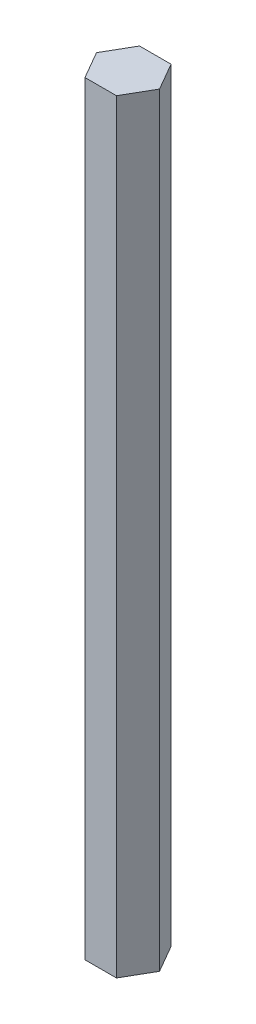
ISO-10303-21;
HEADER;
FILE_DESCRIPTION(('STEP AP214'),'2;1');
FILE_NAME('part.step','',(''),(''),'','','');
FILE_SCHEMA(('AUTOMOTIVE_DESIGN { 1 0 10303 214 1 1 1 1 }'));
ENDSEC;
DATA;
#1=APPLICATION_CONTEXT('core data for automotive mechanical design processes');
#2=APPLICATION_PROTOCOL_DEFINITION('international standard','automotive_design',2000,#1);
#3=PRODUCT_CONTEXT('',#1,'mechanical');
#4=PRODUCT('Part','Part','',(#3));
#5=PRODUCT_RELATED_PRODUCT_CATEGORY('part','',(#4));
#6=PRODUCT_DEFINITION_FORMATION('','',#4);
#7=PRODUCT_DEFINITION_CONTEXT('part definition',#1,'design');
#8=PRODUCT_DEFINITION('design','',#6,#7);
#9=PRODUCT_DEFINITION_SHAPE('','',#8);
#10=(LENGTH_UNIT() NAMED_UNIT(*) SI_UNIT(.MILLI.,.METRE.));
#11=(NAMED_UNIT(*) PLANE_ANGLE_UNIT() SI_UNIT($,.RADIAN.));
#12=(NAMED_UNIT(*) SI_UNIT($,.STERADIAN.) SOLID_ANGLE_UNIT());
#13=UNCERTAINTY_MEASURE_WITH_UNIT(LENGTH_MEASURE(1.E-05),#10,'distance_accuracy_value','');
#14=(GEOMETRIC_REPRESENTATION_CONTEXT(3) GLOBAL_UNCERTAINTY_ASSIGNED_CONTEXT((#13)) GLOBAL_UNIT_ASSIGNED_CONTEXT((#10,
#11,#12)) REPRESENTATION_CONTEXT('',''));
#15=CARTESIAN_POINT('',(0.,0.,0.));
#16=DIRECTION('',(0.,0.,1.));
#17=DIRECTION('',(1.,0.,0.));
#18=AXIS2_PLACEMENT_3D('',#15,#16,#17);
#19=CARTESIAN_POINT('',(-3.66617420935412,177.8,-6.35));
#20=DIRECTION('',(0.866025403784439,0.,0.5));
#21=DIRECTION('',(0.5,0.,-0.866025403784439));
#22=AXIS2_PLACEMENT_3D('',#19,#20,#21);
#23=PLANE('',#22);
#24=DIRECTION('',(-0.5,0.,0.866025403784439));
#25=VECTOR('',#24,1.);
#26=CARTESIAN_POINT('',(-3.66617420935412,0.,-6.35));
#27=LINE('',#26,#25);
#28=CARTESIAN_POINT('',(-3.66617420935412,0.,-6.35));
#29=VERTEX_POINT('',#28);
#30=CARTESIAN_POINT('',(-7.33234841870825,0.,0.));
#31=VERTEX_POINT('',#30);
#32=EDGE_CURVE('E120',#29,#31,#27,.T.);
#33=ORIENTED_EDGE('',*,*,#32,.T.);
#34=DIRECTION('',(0.,-1.,0.));
#35=VECTOR('',#34,1.);
#36=CARTESIAN_POINT('',(-7.33234841870825,177.8,0.));
#37=LINE('',#36,#35);
#38=CARTESIAN_POINT('',(-7.33234841870825,177.8,0.));
#39=VERTEX_POINT('',#38);
#40=EDGE_CURVE('E11',#39,#31,#37,.T.);
#41=ORIENTED_EDGE('',*,*,#40,.F.);
#42=DIRECTION('',(-0.5,0.,0.866025403784439));
#43=VECTOR('',#42,1.);
#44=CARTESIAN_POINT('',(-3.66617420935412,177.8,-6.35));
#45=LINE('',#44,#43);
#46=CARTESIAN_POINT('',(-3.66617420935412,177.8,-6.35));
#47=VERTEX_POINT('',#46);
#48=EDGE_CURVE('E130',#47,#39,#45,.T.);
#49=ORIENTED_EDGE('',*,*,#48,.F.);
#50=DIRECTION('',(0.,-1.,0.));
#51=VECTOR('',#50,1.);
#52=CARTESIAN_POINT('',(-3.66617420935412,177.8,-6.35));
#53=LINE('',#52,#51);
#54=EDGE_CURVE('E116',#47,#29,#53,.T.);
#55=ORIENTED_EDGE('',*,*,#54,.T.);
#56=EDGE_LOOP('',(#33,#41,#49,#55));
#57=FACE_BOUND('',#56,.T.);
#58=ADVANCED_FACE('F36',(#57),#23,.F.);
#59=CARTESIAN_POINT('',(-7.33234841870825,177.8,0.));
#60=DIRECTION('',(0.866025403784439,0.,-0.5));
#61=DIRECTION('',(-0.5,0.,-0.866025403784439));
#62=AXIS2_PLACEMENT_3D('',#59,#60,#61);
#63=PLANE('',#62);
#64=DIRECTION('',(0.5,0.,0.866025403784439));
#65=VECTOR('',#64,1.);
#66=CARTESIAN_POINT('',(-7.33234841870825,0.,0.));
#67=LINE('',#66,#65);
#68=CARTESIAN_POINT('',(-3.66617420935412,0.,6.35));
#69=VERTEX_POINT('',#68);
#70=EDGE_CURVE('E123',#31,#69,#67,.T.);
#71=ORIENTED_EDGE('',*,*,#70,.T.);
#72=DIRECTION('',(0.,-1.,0.));
#73=VECTOR('',#72,1.);
#74=CARTESIAN_POINT('',(-3.66617420935412,177.8,6.35));
#75=LINE('',#74,#73);
#76=CARTESIAN_POINT('',(-3.66617420935412,177.8,6.35));
#77=VERTEX_POINT('',#76);
#78=EDGE_CURVE('E44',#77,#69,#75,.T.);
#79=ORIENTED_EDGE('',*,*,#78,.F.);
#80=DIRECTION('',(0.5,0.,0.866025403784439));
#81=VECTOR('',#80,1.);
#82=CARTESIAN_POINT('',(-7.33234841870825,177.8,0.));
#83=LINE('',#82,#81);
#84=EDGE_CURVE('E89',#39,#77,#83,.T.);
#85=ORIENTED_EDGE('',*,*,#84,.F.);
#86=ORIENTED_EDGE('',*,*,#40,.T.);
#87=EDGE_LOOP('',(#71,#79,#85,#86));
#88=FACE_BOUND('',#87,.T.);
#89=ADVANCED_FACE('F154',(#88),#63,.F.);
#90=CARTESIAN_POINT('',(-3.66617420935412,177.8,6.35));
#91=DIRECTION('',(0.,0.,-1.));
#92=DIRECTION('',(-1.,0.,0.));
#93=AXIS2_PLACEMENT_3D('',#90,#91,#92);
#94=PLANE('',#93);
#95=DIRECTION('',(1.,0.,0.));
#96=VECTOR('',#95,1.);
#97=CARTESIAN_POINT('',(-3.66617420935412,0.,6.35));
#98=LINE('',#97,#96);
#99=CARTESIAN_POINT('',(3.66617420935413,0.,6.35));
#100=VERTEX_POINT('',#99);
#101=EDGE_CURVE('E125',#69,#100,#98,.T.);
#102=ORIENTED_EDGE('',*,*,#101,.T.);
#103=DIRECTION('',(0.,-1.,0.));
#104=VECTOR('',#103,1.);
#105=CARTESIAN_POINT('',(3.66617420935413,177.8,6.35));
#106=LINE('',#105,#104);
#107=CARTESIAN_POINT('',(3.66617420935413,177.8,6.35));
#108=VERTEX_POINT('',#107);
#109=EDGE_CURVE('E111',#108,#100,#106,.T.);
#110=ORIENTED_EDGE('',*,*,#109,.F.);
#111=DIRECTION('',(1.,0.,0.));
#112=VECTOR('',#111,1.);
#113=CARTESIAN_POINT('',(-3.66617420935412,177.8,6.35));
#114=LINE('',#113,#112);
#115=EDGE_CURVE('E102',#77,#108,#114,.T.);
#116=ORIENTED_EDGE('',*,*,#115,.F.);
#117=ORIENTED_EDGE('',*,*,#78,.T.);
#118=EDGE_LOOP('',(#102,#110,#116,#117));
#119=FACE_BOUND('',#118,.T.);
#120=ADVANCED_FACE('F136',(#119),#94,.F.);
#121=CARTESIAN_POINT('',(3.66617420935413,177.8,6.35));
#122=DIRECTION('',(-0.866025403784439,0.,-0.5));
#123=DIRECTION('',(-0.5,0.,0.866025403784439));
#124=AXIS2_PLACEMENT_3D('',#121,#122,#123);
#125=PLANE('',#124);
#126=DIRECTION('',(0.5,0.,-0.866025403784439));
#127=VECTOR('',#126,1.);
#128=CARTESIAN_POINT('',(3.66617420935413,0.,6.35));
#129=LINE('',#128,#127);
#130=CARTESIAN_POINT('',(7.33234841870825,0.,0.));
#131=VERTEX_POINT('',#130);
#132=EDGE_CURVE('E110',#100,#131,#129,.T.);
#133=ORIENTED_EDGE('',*,*,#132,.T.);
#134=DIRECTION('',(0.,-1.,0.));
#135=VECTOR('',#134,1.);
#136=CARTESIAN_POINT('',(7.33234841870825,177.8,0.));
#137=LINE('',#136,#135);
#138=CARTESIAN_POINT('',(7.33234841870825,177.8,0.));
#139=VERTEX_POINT('',#138);
#140=EDGE_CURVE('E107',#139,#131,#137,.T.);
#141=ORIENTED_EDGE('',*,*,#140,.F.);
#142=DIRECTION('',(0.5,0.,-0.866025403784439));
#143=VECTOR('',#142,1.);
#144=CARTESIAN_POINT('',(3.66617420935413,177.8,6.35));
#145=LINE('',#144,#143);
#146=EDGE_CURVE('E96',#108,#139,#145,.T.);
#147=ORIENTED_EDGE('',*,*,#146,.F.);
#148=ORIENTED_EDGE('',*,*,#109,.T.);
#149=EDGE_LOOP('',(#133,#141,#147,#148));
#150=FACE_BOUND('',#149,.T.);
#151=ADVANCED_FACE('F108',(#150),#125,.F.);
#152=CARTESIAN_POINT('',(7.33234841870825,177.8,0.));
#153=DIRECTION('',(-0.866025403784439,0.,0.5));
#154=DIRECTION('',(0.5,0.,0.866025403784439));
#155=AXIS2_PLACEMENT_3D('',#152,#153,#154);
#156=PLANE('',#155);
#157=DIRECTION('',(-0.5,0.,-0.866025403784439));
#158=VECTOR('',#157,1.);
#159=CARTESIAN_POINT('',(7.33234841870825,0.,0.));
#160=LINE('',#159,#158);
#161=CARTESIAN_POINT('',(3.66617420935413,0.,-6.35));
#162=VERTEX_POINT('',#161);
#163=EDGE_CURVE('E75',#131,#162,#160,.T.);
#164=ORIENTED_EDGE('',*,*,#163,.T.);
#165=DIRECTION('',(0.,-1.,0.));
#166=VECTOR('',#165,1.);
#167=CARTESIAN_POINT('',(3.66617420935413,177.8,-6.35));
#168=LINE('',#167,#166);
#169=CARTESIAN_POINT('',(3.66617420935413,177.8,-6.35));
#170=VERTEX_POINT('',#169);
#171=EDGE_CURVE('E112',#170,#162,#168,.T.);
#172=ORIENTED_EDGE('',*,*,#171,.F.);
#173=DIRECTION('',(-0.5,0.,-0.866025403784439));
#174=VECTOR('',#173,1.);
#175=CARTESIAN_POINT('',(7.33234841870825,177.8,0.));
#176=LINE('',#175,#174);
#177=EDGE_CURVE('E100',#139,#170,#176,.T.);
#178=ORIENTED_EDGE('',*,*,#177,.F.);
#179=ORIENTED_EDGE('',*,*,#140,.T.);
#180=EDGE_LOOP('',(#164,#172,#178,#179));
#181=FACE_BOUND('',#180,.T.);
#182=ADVANCED_FACE('F114',(#181),#156,.F.);
#183=CARTESIAN_POINT('',(3.66617420935413,177.8,-6.35));
#184=DIRECTION('',(0.,0.,1.));
#185=DIRECTION('',(1.,0.,0.));
#186=AXIS2_PLACEMENT_3D('',#183,#184,#185);
#187=PLANE('',#186);
#188=DIRECTION('',(-1.,0.,0.));
#189=VECTOR('',#188,1.);
#190=CARTESIAN_POINT('',(3.66617420935413,0.,-6.35));
#191=LINE('',#190,#189);
#192=EDGE_CURVE('E81',#162,#29,#191,.T.);
#193=ORIENTED_EDGE('',*,*,#192,.T.);
#194=ORIENTED_EDGE('',*,*,#54,.F.);
#195=DIRECTION('',(-1.,0.,0.));
#196=VECTOR('',#195,1.);
#197=CARTESIAN_POINT('',(3.66617420935413,177.8,-6.35));
#198=LINE('',#197,#196);
#199=EDGE_CURVE('E52',#170,#47,#198,.T.);
#200=ORIENTED_EDGE('',*,*,#199,.F.);
#201=ORIENTED_EDGE('',*,*,#171,.T.);
#202=EDGE_LOOP('',(#193,#194,#200,#201));
#203=FACE_BOUND('',#202,.T.);
#204=ADVANCED_FACE('F143',(#203),#187,.F.);
#205=CARTESIAN_POINT('',(0.,177.8,0.));
#206=DIRECTION('',(0.,1.,0.));
#207=DIRECTION('',(0.,0.,1.));
#208=AXIS2_PLACEMENT_3D('',#205,#206,#207);
#209=PLANE('',#208);
#210=ORIENTED_EDGE('',*,*,#48,.T.);
#211=ORIENTED_EDGE('',*,*,#84,.T.);
#212=ORIENTED_EDGE('',*,*,#115,.T.);
#213=ORIENTED_EDGE('',*,*,#146,.T.);
#214=ORIENTED_EDGE('',*,*,#177,.T.);
#215=ORIENTED_EDGE('',*,*,#199,.T.);
#216=EDGE_LOOP('',(#210,#211,#212,#213,#214,#215));
#217=FACE_BOUND('',#216,.T.);
#218=ADVANCED_FACE('F98',(#217),#209,.T.);
#219=CARTESIAN_POINT('',(0.,0.,0.));
#220=DIRECTION('',(0.,1.,0.));
#221=DIRECTION('',(0.,0.,1.));
#222=AXIS2_PLACEMENT_3D('',#219,#220,#221);
#223=PLANE('',#222);
#224=ORIENTED_EDGE('',*,*,#32,.F.);
#225=ORIENTED_EDGE('',*,*,#192,.F.);
#226=ORIENTED_EDGE('',*,*,#163,.F.);
#227=ORIENTED_EDGE('',*,*,#132,.F.);
#228=ORIENTED_EDGE('',*,*,#101,.F.);
#229=ORIENTED_EDGE('',*,*,#70,.F.);
#230=EDGE_LOOP('',(#224,#225,#226,#227,#228,#229));
#231=FACE_BOUND('',#230,.T.);
#232=ADVANCED_FACE('F139',(#231),#223,.F.);
#233=CLOSED_SHELL('',(#58,#89,#120,#151,#182,#204,#218,#232));
#234=MANIFOLD_SOLID_BREP('B2',#233);
#235=ADVANCED_BREP_SHAPE_REPRESENTATION('',(#18,#234),#14);
#236=SHAPE_DEFINITION_REPRESENTATION(#9,#235);
ENDSEC;
END-ISO-10303-21;
